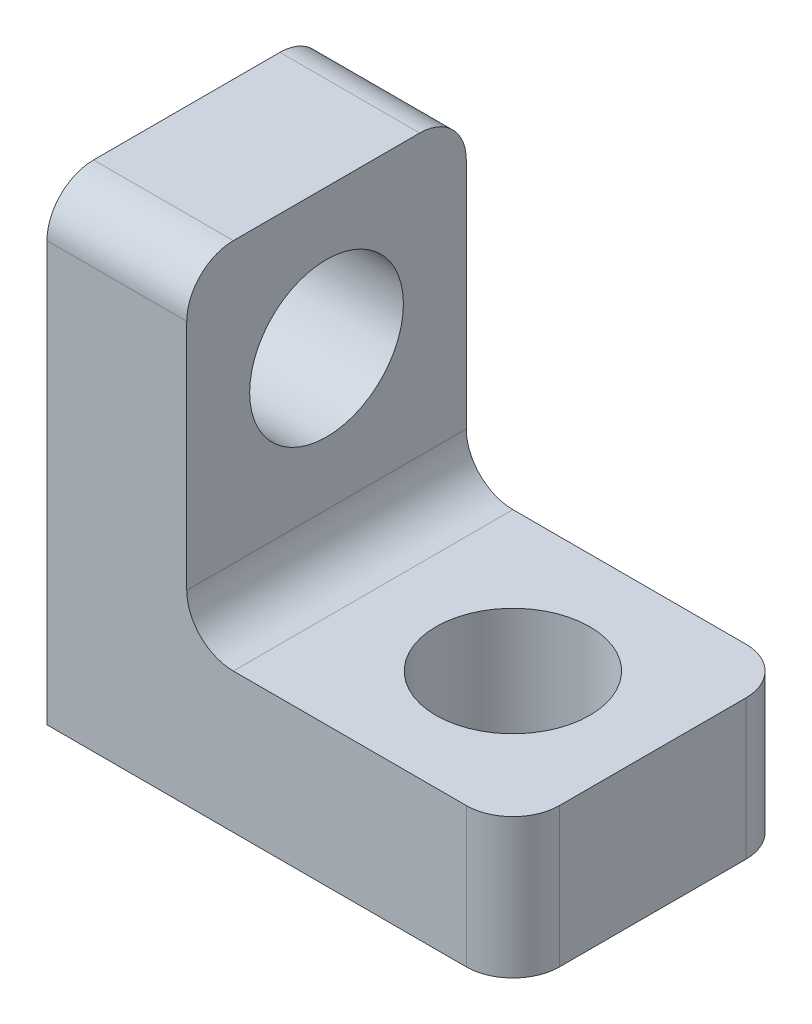
ISO-10303-21;
HEADER;
FILE_DESCRIPTION(('STEP AP214'),'2;1');
FILE_NAME('part.step','',(''),(''),'','','');
FILE_SCHEMA(('AUTOMOTIVE_DESIGN { 1 0 10303 214 1 1 1 1 }'));
ENDSEC;
DATA;
#1=APPLICATION_CONTEXT('core data for automotive mechanical design processes');
#2=APPLICATION_PROTOCOL_DEFINITION('international standard','automotive_design',2000,#1);
#3=PRODUCT_CONTEXT('',#1,'mechanical');
#4=PRODUCT('Part','Part','',(#3));
#5=PRODUCT_RELATED_PRODUCT_CATEGORY('part','',(#4));
#6=PRODUCT_DEFINITION_FORMATION('','',#4);
#7=PRODUCT_DEFINITION_CONTEXT('part definition',#1,'design');
#8=PRODUCT_DEFINITION('design','',#6,#7);
#9=PRODUCT_DEFINITION_SHAPE('','',#8);
#10=(LENGTH_UNIT() NAMED_UNIT(*) SI_UNIT(.MILLI.,.METRE.));
#11=(NAMED_UNIT(*) PLANE_ANGLE_UNIT() SI_UNIT($,.RADIAN.));
#12=(NAMED_UNIT(*) SI_UNIT($,.STERADIAN.) SOLID_ANGLE_UNIT());
#13=UNCERTAINTY_MEASURE_WITH_UNIT(LENGTH_MEASURE(1.E-05),#10,'distance_accuracy_value','');
#14=(GEOMETRIC_REPRESENTATION_CONTEXT(3) GLOBAL_UNCERTAINTY_ASSIGNED_CONTEXT((#13)) GLOBAL_UNIT_ASSIGNED_CONTEXT((#10,
#11,#12)) REPRESENTATION_CONTEXT('',''));
#15=CARTESIAN_POINT('',(0.,0.,0.));
#16=DIRECTION('',(0.,0.,1.));
#17=DIRECTION('',(1.,0.,0.));
#18=AXIS2_PLACEMENT_3D('',#15,#16,#17);
#19=CARTESIAN_POINT('',(10.,3.,6.));
#20=DIRECTION('',(-1.,0.,0.));
#21=DIRECTION('',(0.,-1.,0.));
#22=AXIS2_PLACEMENT_3D('',#19,#20,#21);
#23=PLANE('',#22);
#24=DIRECTION('',(0.,0.,-1.));
#25=VECTOR('',#24,1.);
#26=CARTESIAN_POINT('',(10.,0.,6.));
#27=LINE('',#26,#25);
#28=CARTESIAN_POINT('',(10.,0.,5.));
#29=VERTEX_POINT('',#28);
#30=CARTESIAN_POINT('',(10.,0.,1.));
#31=VERTEX_POINT('',#30);
#32=EDGE_CURVE('E142',#29,#31,#27,.T.);
#33=ORIENTED_EDGE('',*,*,#32,.T.);
#34=DIRECTION('',(0.,1.,0.));
#35=VECTOR('',#34,1.);
#36=CARTESIAN_POINT('',(10.,3.,1.));
#37=LINE('',#36,#35);
#38=CARTESIAN_POINT('',(10.,3.,1.));
#39=VERTEX_POINT('',#38);
#40=EDGE_CURVE('E178',#31,#39,#37,.T.);
#41=ORIENTED_EDGE('',*,*,#40,.T.);
#42=DIRECTION('',(0.,0.,-1.));
#43=VECTOR('',#42,1.);
#44=CARTESIAN_POINT('',(10.,3.,6.));
#45=LINE('',#44,#43);
#46=CARTESIAN_POINT('',(10.,3.,5.));
#47=VERTEX_POINT('',#46);
#48=EDGE_CURVE('E166',#47,#39,#45,.T.);
#49=ORIENTED_EDGE('',*,*,#48,.F.);
#50=DIRECTION('',(0.,1.,0.));
#51=VECTOR('',#50,1.);
#52=CARTESIAN_POINT('',(10.,3.,5.));
#53=LINE('',#52,#51);
#54=EDGE_CURVE('E169',#47,#29,#53,.F.);
#55=ORIENTED_EDGE('',*,*,#54,.T.);
#56=EDGE_LOOP('',(#33,#41,#49,#55));
#57=FACE_BOUND('',#56,.T.);
#58=ADVANCED_FACE('F34',(#57),#23,.F.);
#59=CARTESIAN_POINT('',(3.,3.,6.));
#60=DIRECTION('',(0.,-1.,0.));
#61=DIRECTION('',(0.,0.,-1.));
#62=AXIS2_PLACEMENT_3D('',#59,#60,#61);
#63=PLANE('',#62);
#64=CARTESIAN_POINT('',(7.,3.,3.));
#65=DIRECTION('',(0.,1.,0.));
#66=DIRECTION('',(0.,0.,1.));
#67=AXIS2_PLACEMENT_3D('',#64,#65,#66);
#68=CIRCLE('',#67,1.65);
#69=CARTESIAN_POINT('',(7.,3.,4.65));
#70=VERTEX_POINT('',#69);
#71=EDGE_CURVE('E176',#70,#70,#68,.T.);
#72=ORIENTED_EDGE('',*,*,#71,.F.);
#73=EDGE_LOOP('',(#72));
#74=FACE_BOUND('',#73,.T.);
#75=ORIENTED_EDGE('',*,*,#48,.T.);
#76=CARTESIAN_POINT('',(9.,3.,1.));
#77=DIRECTION('',(0.,-1.,0.));
#78=DIRECTION('',(0.,0.,-1.));
#79=AXIS2_PLACEMENT_3D('',#76,#77,#78);
#80=CIRCLE('',#79,1.);
#81=CARTESIAN_POINT('',(9.,3.,0.));
#82=VERTEX_POINT('',#81);
#83=EDGE_CURVE('E185',#39,#82,#80,.F.);
#84=ORIENTED_EDGE('',*,*,#83,.T.);
#85=DIRECTION('',(-1.,0.,0.));
#86=VECTOR('',#85,1.);
#87=CARTESIAN_POINT('',(3.,3.,0.));
#88=LINE('',#87,#86);
#89=CARTESIAN_POINT('',(4.,3.,0.));
#90=VERTEX_POINT('',#89);
#91=EDGE_CURVE('E153',#82,#90,#88,.T.);
#92=ORIENTED_EDGE('',*,*,#91,.T.);
#93=DIRECTION('',(0.,0.,-1.));
#94=VECTOR('',#93,1.);
#95=CARTESIAN_POINT('',(4.,3.,6.));
#96=LINE('',#95,#94);
#97=CARTESIAN_POINT('',(4.,3.,6.));
#98=VERTEX_POINT('',#97);
#99=EDGE_CURVE('E181',#90,#98,#96,.F.);
#100=ORIENTED_EDGE('',*,*,#99,.T.);
#101=DIRECTION('',(-1.,0.,0.));
#102=VECTOR('',#101,1.);
#103=CARTESIAN_POINT('',(3.,3.,6.));
#104=LINE('',#103,#102);
#105=CARTESIAN_POINT('',(9.,3.,6.));
#106=VERTEX_POINT('',#105);
#107=EDGE_CURVE('E161',#106,#98,#104,.T.);
#108=ORIENTED_EDGE('',*,*,#107,.F.);
#109=CARTESIAN_POINT('',(9.,3.,5.));
#110=DIRECTION('',(0.,-1.,0.));
#111=DIRECTION('',(0.,0.,-1.));
#112=AXIS2_PLACEMENT_3D('',#109,#110,#111);
#113=CIRCLE('',#112,1.);
#114=EDGE_CURVE('E183',#106,#47,#113,.F.);
#115=ORIENTED_EDGE('',*,*,#114,.T.);
#116=EDGE_LOOP('',(#75,#84,#92,#100,#108,#115));
#117=FACE_BOUND('',#116,.T.);
#118=ADVANCED_FACE('F219',(#74,#117),#63,.F.);
#119=CARTESIAN_POINT('',(3.,10.,6.));
#120=DIRECTION('',(-1.,0.,0.));
#121=DIRECTION('',(0.,-1.,0.));
#122=AXIS2_PLACEMENT_3D('',#119,#120,#121);
#123=PLANE('',#122);
#124=CARTESIAN_POINT('',(3.,7.,3.));
#125=DIRECTION('',(1.,0.,0.));
#126=DIRECTION('',(0.,1.,0.));
#127=AXIS2_PLACEMENT_3D('',#124,#125,#126);
#128=CIRCLE('',#127,1.65);
#129=CARTESIAN_POINT('',(3.,8.65,3.));
#130=VERTEX_POINT('',#129);
#131=EDGE_CURVE('E172',#130,#130,#128,.T.);
#132=ORIENTED_EDGE('',*,*,#131,.F.);
#133=EDGE_LOOP('',(#132));
#134=FACE_BOUND('',#133,.T.);
#135=DIRECTION('',(0.,1.,0.));
#136=VECTOR('',#135,1.);
#137=CARTESIAN_POINT('',(3.,10.,0.));
#138=LINE('',#137,#136);
#139=CARTESIAN_POINT('',(3.,4.,0.));
#140=VERTEX_POINT('',#139);
#141=CARTESIAN_POINT('',(3.,9.,0.));
#142=VERTEX_POINT('',#141);
#143=EDGE_CURVE('E156',#140,#142,#138,.T.);
#144=ORIENTED_EDGE('',*,*,#143,.T.);
#145=CARTESIAN_POINT('',(3.,9.,1.));
#146=DIRECTION('',(-1.,0.,0.));
#147=DIRECTION('',(0.,-1.,0.));
#148=AXIS2_PLACEMENT_3D('',#145,#146,#147);
#149=CIRCLE('',#148,1.);
#150=CARTESIAN_POINT('',(3.,10.,1.));
#151=VERTEX_POINT('',#150);
#152=EDGE_CURVE('E49',#142,#151,#149,.F.);
#153=ORIENTED_EDGE('',*,*,#152,.T.);
#154=DIRECTION('',(0.,0.,-1.));
#155=VECTOR('',#154,1.);
#156=CARTESIAN_POINT('',(3.,10.,6.));
#157=LINE('',#156,#155);
#158=CARTESIAN_POINT('',(3.,10.,5.));
#159=VERTEX_POINT('',#158);
#160=EDGE_CURVE('E164',#159,#151,#157,.T.);
#161=ORIENTED_EDGE('',*,*,#160,.F.);
#162=CARTESIAN_POINT('',(3.,9.,5.));
#163=DIRECTION('',(-1.,0.,0.));
#164=DIRECTION('',(0.,-1.,0.));
#165=AXIS2_PLACEMENT_3D('',#162,#163,#164);
#166=CIRCLE('',#165,1.);
#167=CARTESIAN_POINT('',(3.,9.,6.));
#168=VERTEX_POINT('',#167);
#169=EDGE_CURVE('E208',#159,#168,#166,.F.);
#170=ORIENTED_EDGE('',*,*,#169,.T.);
#171=DIRECTION('',(0.,1.,0.));
#172=VECTOR('',#171,1.);
#173=CARTESIAN_POINT('',(3.,10.,6.));
#174=LINE('',#173,#172);
#175=CARTESIAN_POINT('',(3.,4.,6.));
#176=VERTEX_POINT('',#175);
#177=EDGE_CURVE('E130',#176,#168,#174,.T.);
#178=ORIENTED_EDGE('',*,*,#177,.F.);
#179=DIRECTION('',(0.,0.,-1.));
#180=VECTOR('',#179,1.);
#181=CARTESIAN_POINT('',(3.,4.,0.));
#182=LINE('',#181,#180);
#183=EDGE_CURVE('E205',#176,#140,#182,.T.);
#184=ORIENTED_EDGE('',*,*,#183,.T.);
#185=EDGE_LOOP('',(#144,#153,#161,#170,#178,#184));
#186=FACE_BOUND('',#185,.T.);
#187=ADVANCED_FACE('F224',(#134,#186),#123,.F.);
#188=CARTESIAN_POINT('',(0.,10.,6.));
#189=DIRECTION('',(0.,-1.,0.));
#190=DIRECTION('',(0.,0.,-1.));
#191=AXIS2_PLACEMENT_3D('',#188,#189,#190);
#192=PLANE('',#191);
#193=ORIENTED_EDGE('',*,*,#160,.T.);
#194=DIRECTION('',(-1.,0.,0.));
#195=VECTOR('',#194,1.);
#196=CARTESIAN_POINT('',(0.,10.,1.));
#197=LINE('',#196,#195);
#198=CARTESIAN_POINT('',(0.,10.,1.));
#199=VERTEX_POINT('',#198);
#200=EDGE_CURVE('E198',#151,#199,#197,.T.);
#201=ORIENTED_EDGE('',*,*,#200,.T.);
#202=DIRECTION('',(0.,0.,-1.));
#203=VECTOR('',#202,1.);
#204=CARTESIAN_POINT('',(0.,10.,6.));
#205=LINE('',#204,#203);
#206=CARTESIAN_POINT('',(0.,10.,5.));
#207=VERTEX_POINT('',#206);
#208=EDGE_CURVE('E141',#207,#199,#205,.T.);
#209=ORIENTED_EDGE('',*,*,#208,.F.);
#210=DIRECTION('',(-1.,0.,0.));
#211=VECTOR('',#210,1.);
#212=CARTESIAN_POINT('',(0.,10.,5.));
#213=LINE('',#212,#211);
#214=EDGE_CURVE('E56',#207,#159,#213,.F.);
#215=ORIENTED_EDGE('',*,*,#214,.T.);
#216=EDGE_LOOP('',(#193,#201,#209,#215));
#217=FACE_BOUND('',#216,.T.);
#218=ADVANCED_FACE('F242',(#217),#192,.F.);
#219=CARTESIAN_POINT('',(0.,0.,6.));
#220=DIRECTION('',(1.,0.,0.));
#221=DIRECTION('',(0.,0.,-1.));
#222=AXIS2_PLACEMENT_3D('',#219,#220,#221);
#223=PLANE('',#222);
#224=CARTESIAN_POINT('',(0.,7.,3.));
#225=DIRECTION('',(1.,0.,0.));
#226=DIRECTION('',(0.,0.,-1.));
#227=AXIS2_PLACEMENT_3D('',#224,#225,#226);
#228=CIRCLE('',#227,1.65);
#229=CARTESIAN_POINT('',(0.,7.,1.35));
#230=VERTEX_POINT('',#229);
#231=EDGE_CURVE('E157',#230,#230,#228,.T.);
#232=ORIENTED_EDGE('',*,*,#231,.T.);
#233=EDGE_LOOP('',(#232));
#234=FACE_BOUND('',#233,.T.);
#235=ORIENTED_EDGE('',*,*,#208,.T.);
#236=CARTESIAN_POINT('',(0.,9.,1.));
#237=DIRECTION('',(1.,0.,0.));
#238=DIRECTION('',(0.,0.,-1.));
#239=AXIS2_PLACEMENT_3D('',#236,#237,#238);
#240=CIRCLE('',#239,1.);
#241=CARTESIAN_POINT('',(0.,9.,0.));
#242=VERTEX_POINT('',#241);
#243=EDGE_CURVE('E203',#199,#242,#240,.F.);
#244=ORIENTED_EDGE('',*,*,#243,.T.);
#245=DIRECTION('',(0.,-1.,0.));
#246=VECTOR('',#245,1.);
#247=CARTESIAN_POINT('',(0.,0.,0.));
#248=LINE('',#247,#246);
#249=CARTESIAN_POINT('',(0.,0.,0.));
#250=VERTEX_POINT('',#249);
#251=EDGE_CURVE('E137',#242,#250,#248,.T.);
#252=ORIENTED_EDGE('',*,*,#251,.T.);
#253=DIRECTION('',(0.,0.,-1.));
#254=VECTOR('',#253,1.);
#255=CARTESIAN_POINT('',(0.,0.,6.));
#256=LINE('',#255,#254);
#257=CARTESIAN_POINT('',(0.,0.,6.));
#258=VERTEX_POINT('',#257);
#259=EDGE_CURVE('E133',#258,#250,#256,.T.);
#260=ORIENTED_EDGE('',*,*,#259,.F.);
#261=DIRECTION('',(0.,-1.,0.));
#262=VECTOR('',#261,1.);
#263=CARTESIAN_POINT('',(0.,0.,6.));
#264=LINE('',#263,#262);
#265=CARTESIAN_POINT('',(0.,9.,6.));
#266=VERTEX_POINT('',#265);
#267=EDGE_CURVE('E119',#266,#258,#264,.T.);
#268=ORIENTED_EDGE('',*,*,#267,.F.);
#269=CARTESIAN_POINT('',(0.,9.,5.));
#270=DIRECTION('',(1.,0.,0.));
#271=DIRECTION('',(0.,0.,-1.));
#272=AXIS2_PLACEMENT_3D('',#269,#270,#271);
#273=CIRCLE('',#272,1.);
#274=EDGE_CURVE('E201',#266,#207,#273,.F.);
#275=ORIENTED_EDGE('',*,*,#274,.T.);
#276=EDGE_LOOP('',(#235,#244,#252,#260,#268,#275));
#277=FACE_BOUND('',#276,.T.);
#278=ADVANCED_FACE('F135',(#234,#277),#223,.F.);
#279=CARTESIAN_POINT('',(10.,0.,6.));
#280=DIRECTION('',(0.,1.,0.));
#281=DIRECTION('',(0.,0.,1.));
#282=AXIS2_PLACEMENT_3D('',#279,#280,#281);
#283=PLANE('',#282);
#284=CARTESIAN_POINT('',(7.,0.,3.));
#285=DIRECTION('',(0.,1.,0.));
#286=DIRECTION('',(0.,0.,1.));
#287=AXIS2_PLACEMENT_3D('',#284,#285,#286);
#288=CIRCLE('',#287,1.65);
#289=CARTESIAN_POINT('',(7.,0.,4.65));
#290=VERTEX_POINT('',#289);
#291=EDGE_CURVE('E173',#290,#290,#288,.T.);
#292=ORIENTED_EDGE('',*,*,#291,.T.);
#293=EDGE_LOOP('',(#292));
#294=FACE_BOUND('',#293,.T.);
#295=DIRECTION('',(1.,0.,0.));
#296=VECTOR('',#295,1.);
#297=CARTESIAN_POINT('',(10.,0.,0.));
#298=LINE('',#297,#296);
#299=CARTESIAN_POINT('',(9.,0.,0.));
#300=VERTEX_POINT('',#299);
#301=EDGE_CURVE('E160',#250,#300,#298,.T.);
#302=ORIENTED_EDGE('',*,*,#301,.T.);
#303=CARTESIAN_POINT('',(9.,0.,1.));
#304=DIRECTION('',(0.,1.,0.));
#305=DIRECTION('',(0.,0.,1.));
#306=AXIS2_PLACEMENT_3D('',#303,#304,#305);
#307=CIRCLE('',#306,1.);
#308=EDGE_CURVE('E192',#300,#31,#307,.F.);
#309=ORIENTED_EDGE('',*,*,#308,.T.);
#310=ORIENTED_EDGE('',*,*,#32,.F.);
#311=CARTESIAN_POINT('',(9.,0.,5.));
#312=DIRECTION('',(0.,1.,0.));
#313=DIRECTION('',(0.,0.,1.));
#314=AXIS2_PLACEMENT_3D('',#311,#312,#313);
#315=CIRCLE('',#314,1.);
#316=CARTESIAN_POINT('',(9.,0.,6.));
#317=VERTEX_POINT('',#316);
#318=EDGE_CURVE('E147',#29,#317,#315,.F.);
#319=ORIENTED_EDGE('',*,*,#318,.T.);
#320=DIRECTION('',(1.,0.,0.));
#321=VECTOR('',#320,1.);
#322=CARTESIAN_POINT('',(10.,0.,6.));
#323=LINE('',#322,#321);
#324=EDGE_CURVE('E124',#258,#317,#323,.T.);
#325=ORIENTED_EDGE('',*,*,#324,.F.);
#326=ORIENTED_EDGE('',*,*,#259,.T.);
#327=EDGE_LOOP('',(#302,#309,#310,#319,#325,#326));
#328=FACE_BOUND('',#327,.T.);
#329=ADVANCED_FACE('F144',(#294,#328),#283,.F.);
#330=CARTESIAN_POINT('',(0.,0.,6.));
#331=DIRECTION('',(0.,0.,-1.));
#332=DIRECTION('',(-1.,0.,0.));
#333=AXIS2_PLACEMENT_3D('',#330,#331,#332);
#334=PLANE('',#333);
#335=ORIENTED_EDGE('',*,*,#324,.T.);
#336=DIRECTION('',(0.,1.,0.));
#337=VECTOR('',#336,1.);
#338=CARTESIAN_POINT('',(9.,0.,6.));
#339=LINE('',#338,#337);
#340=EDGE_CURVE('E195',#317,#106,#339,.T.);
#341=ORIENTED_EDGE('',*,*,#340,.T.);
#342=ORIENTED_EDGE('',*,*,#107,.T.);
#343=CARTESIAN_POINT('',(4.,4.,6.));
#344=DIRECTION('',(0.,0.,-1.));
#345=DIRECTION('',(-1.,0.,0.));
#346=AXIS2_PLACEMENT_3D('',#343,#344,#345);
#347=CIRCLE('',#346,1.);
#348=EDGE_CURVE('E11',#98,#176,#347,.T.);
#349=ORIENTED_EDGE('',*,*,#348,.T.);
#350=ORIENTED_EDGE('',*,*,#177,.T.);
#351=DIRECTION('',(-1.,0.,0.));
#352=VECTOR('',#351,1.);
#353=CARTESIAN_POINT('',(0.,9.,6.));
#354=LINE('',#353,#352);
#355=EDGE_CURVE('E128',#168,#266,#354,.T.);
#356=ORIENTED_EDGE('',*,*,#355,.T.);
#357=ORIENTED_EDGE('',*,*,#267,.T.);
#358=EDGE_LOOP('',(#335,#341,#342,#349,#350,#356,#357));
#359=FACE_BOUND('',#358,.T.);
#360=ADVANCED_FACE('F121',(#359),#334,.F.);
#361=CARTESIAN_POINT('',(0.,0.,0.));
#362=DIRECTION('',(0.,0.,-1.));
#363=DIRECTION('',(-1.,0.,0.));
#364=AXIS2_PLACEMENT_3D('',#361,#362,#363);
#365=PLANE('',#364);
#366=ORIENTED_EDGE('',*,*,#91,.F.);
#367=DIRECTION('',(0.,1.,0.));
#368=VECTOR('',#367,1.);
#369=CARTESIAN_POINT('',(9.,0.,0.));
#370=LINE('',#369,#368);
#371=EDGE_CURVE('E189',#82,#300,#370,.F.);
#372=ORIENTED_EDGE('',*,*,#371,.T.);
#373=ORIENTED_EDGE('',*,*,#301,.F.);
#374=ORIENTED_EDGE('',*,*,#251,.F.);
#375=DIRECTION('',(-1.,0.,0.));
#376=VECTOR('',#375,1.);
#377=CARTESIAN_POINT('',(3.,9.,0.));
#378=LINE('',#377,#376);
#379=EDGE_CURVE('E187',#242,#142,#378,.F.);
#380=ORIENTED_EDGE('',*,*,#379,.T.);
#381=ORIENTED_EDGE('',*,*,#143,.F.);
#382=CARTESIAN_POINT('',(4.,4.,0.));
#383=DIRECTION('',(0.,0.,-1.));
#384=DIRECTION('',(-1.,0.,0.));
#385=AXIS2_PLACEMENT_3D('',#382,#383,#384);
#386=CIRCLE('',#385,1.);
#387=EDGE_CURVE('E42',#140,#90,#386,.F.);
#388=ORIENTED_EDGE('',*,*,#387,.T.);
#389=EDGE_LOOP('',(#366,#372,#373,#374,#380,#381,#388));
#390=FACE_BOUND('',#389,.T.);
#391=ADVANCED_FACE('F213',(#390),#365,.T.);
#392=CARTESIAN_POINT('',(-3.,7.,3.));
#393=DIRECTION('',(1.,0.,0.));
#394=DIRECTION('',(0.,1.,0.));
#395=AXIS2_PLACEMENT_3D('',#392,#393,#394);
#396=CYLINDRICAL_SURFACE('',#395,1.65);
#397=ORIENTED_EDGE('',*,*,#131,.T.);
#398=EDGE_LOOP('',(#397));
#399=FACE_BOUND('',#398,.T.);
#400=ORIENTED_EDGE('',*,*,#231,.F.);
#401=EDGE_LOOP('',(#400));
#402=FACE_BOUND('',#401,.T.);
#403=ADVANCED_FACE('F284',(#399,#402),#396,.F.);
#404=CARTESIAN_POINT('',(7.,-3.,3.));
#405=DIRECTION('',(0.,1.,0.));
#406=DIRECTION('',(0.,0.,1.));
#407=AXIS2_PLACEMENT_3D('',#404,#405,#406);
#408=CYLINDRICAL_SURFACE('',#407,1.65);
#409=ORIENTED_EDGE('',*,*,#71,.T.);
#410=EDGE_LOOP('',(#409));
#411=FACE_BOUND('',#410,.T.);
#412=ORIENTED_EDGE('',*,*,#291,.F.);
#413=EDGE_LOOP('',(#412));
#414=FACE_BOUND('',#413,.T.);
#415=ADVANCED_FACE('F233',(#411,#414),#408,.F.);
#416=CARTESIAN_POINT('',(9.,3.,1.));
#417=DIRECTION('',(0.,-1.,0.));
#418=DIRECTION('',(1.,0.,0.));
#419=AXIS2_PLACEMENT_3D('',#416,#417,#418);
#420=CYLINDRICAL_SURFACE('',#419,1.);
#421=ORIENTED_EDGE('',*,*,#308,.F.);
#422=ORIENTED_EDGE('',*,*,#371,.F.);
#423=ORIENTED_EDGE('',*,*,#83,.F.);
#424=ORIENTED_EDGE('',*,*,#40,.F.);
#425=EDGE_LOOP('',(#421,#422,#423,#424));
#426=FACE_BOUND('',#425,.T.);
#427=ADVANCED_FACE('F249',(#426),#420,.T.);
#428=CARTESIAN_POINT('',(9.,0.,5.));
#429=DIRECTION('',(0.,1.,0.));
#430=DIRECTION('',(-1.,0.,0.));
#431=AXIS2_PLACEMENT_3D('',#428,#429,#430);
#432=CYLINDRICAL_SURFACE('',#431,1.);
#433=ORIENTED_EDGE('',*,*,#318,.F.);
#434=ORIENTED_EDGE('',*,*,#54,.F.);
#435=ORIENTED_EDGE('',*,*,#114,.F.);
#436=ORIENTED_EDGE('',*,*,#340,.F.);
#437=EDGE_LOOP('',(#433,#434,#435,#436));
#438=FACE_BOUND('',#437,.T.);
#439=ADVANCED_FACE('F252',(#438),#432,.T.);
#440=CARTESIAN_POINT('',(0.,9.,1.));
#441=DIRECTION('',(1.,0.,0.));
#442=DIRECTION('',(0.,0.,-1.));
#443=AXIS2_PLACEMENT_3D('',#440,#441,#442);
#444=CYLINDRICAL_SURFACE('',#443,1.);
#445=ORIENTED_EDGE('',*,*,#152,.F.);
#446=ORIENTED_EDGE('',*,*,#379,.F.);
#447=ORIENTED_EDGE('',*,*,#243,.F.);
#448=ORIENTED_EDGE('',*,*,#200,.F.);
#449=EDGE_LOOP('',(#445,#446,#447,#448));
#450=FACE_BOUND('',#449,.T.);
#451=ADVANCED_FACE('F256',(#450),#444,.T.);
#452=CARTESIAN_POINT('',(0.,9.,5.));
#453=DIRECTION('',(-1.,0.,0.));
#454=DIRECTION('',(0.,0.,1.));
#455=AXIS2_PLACEMENT_3D('',#452,#453,#454);
#456=CYLINDRICAL_SURFACE('',#455,1.);
#457=ORIENTED_EDGE('',*,*,#169,.F.);
#458=ORIENTED_EDGE('',*,*,#214,.F.);
#459=ORIENTED_EDGE('',*,*,#274,.F.);
#460=ORIENTED_EDGE('',*,*,#355,.F.);
#461=EDGE_LOOP('',(#457,#458,#459,#460));
#462=FACE_BOUND('',#461,.T.);
#463=ADVANCED_FACE('F259',(#462),#456,.T.);
#464=CARTESIAN_POINT('',(4.,4.,6.));
#465=DIRECTION('',(0.,0.,1.));
#466=DIRECTION('',(1.,0.,0.));
#467=AXIS2_PLACEMENT_3D('',#464,#465,#466);
#468=CYLINDRICAL_SURFACE('',#467,1.);
#469=ORIENTED_EDGE('',*,*,#348,.F.);
#470=ORIENTED_EDGE('',*,*,#99,.F.);
#471=ORIENTED_EDGE('',*,*,#387,.F.);
#472=ORIENTED_EDGE('',*,*,#183,.F.);
#473=EDGE_LOOP('',(#469,#470,#471,#472));
#474=FACE_BOUND('',#473,.T.);
#475=ADVANCED_FACE('F36',(#474),#468,.F.);
#476=CLOSED_SHELL('',(#58,#118,#187,#218,#278,#329,#360,#391,#403,#415,#427,#439,#451,#463,#475));
#477=MANIFOLD_SOLID_BREP('B2',#476);
#478=ADVANCED_BREP_SHAPE_REPRESENTATION('',(#18,#477),#14);
#479=SHAPE_DEFINITION_REPRESENTATION(#9,#478);
ENDSEC;
END-ISO-10303-21;
